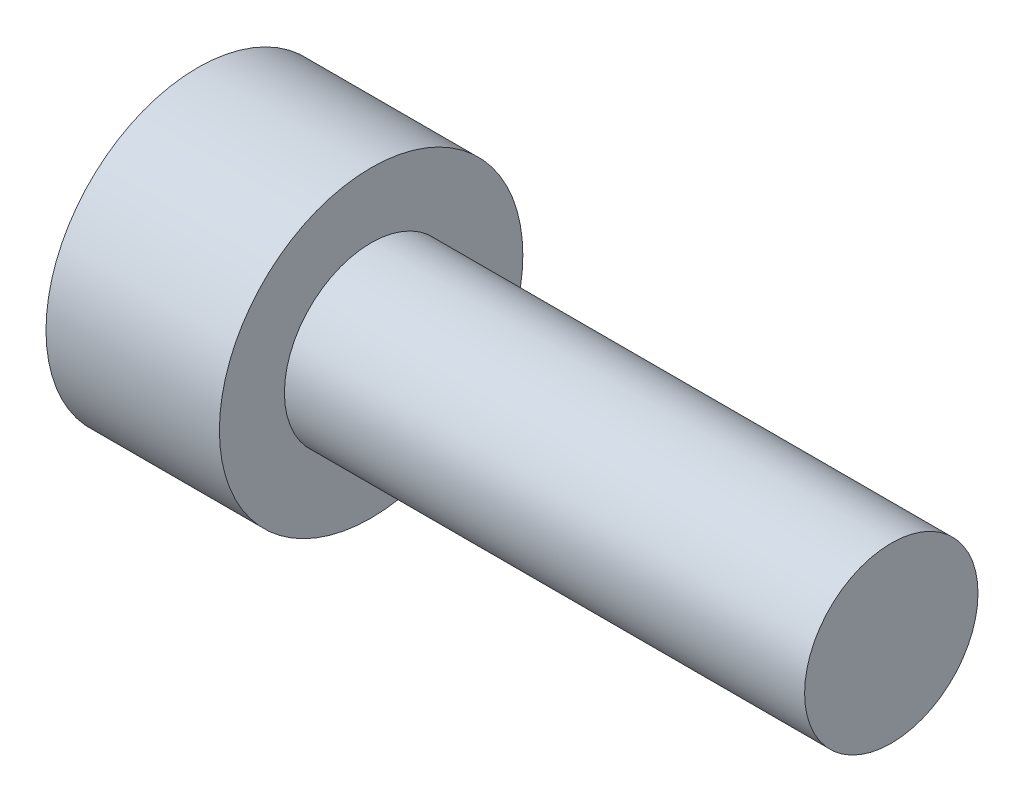
ISO-10303-21;
HEADER;
FILE_DESCRIPTION(('STEP AP214'),'2;1');
FILE_NAME('part.step','',(''),(''),'','','');
FILE_SCHEMA(('AUTOMOTIVE_DESIGN { 1 0 10303 214 1 1 1 1 }'));
ENDSEC;
DATA;
#1=APPLICATION_CONTEXT('core data for automotive mechanical design processes');
#2=APPLICATION_PROTOCOL_DEFINITION('international standard','automotive_design',2000,#1);
#3=PRODUCT_CONTEXT('',#1,'mechanical');
#4=PRODUCT('Part','Part','',(#3));
#5=PRODUCT_RELATED_PRODUCT_CATEGORY('part','',(#4));
#6=PRODUCT_DEFINITION_FORMATION('','',#4);
#7=PRODUCT_DEFINITION_CONTEXT('part definition',#1,'design');
#8=PRODUCT_DEFINITION('design','',#6,#7);
#9=PRODUCT_DEFINITION_SHAPE('','',#8);
#10=(LENGTH_UNIT() NAMED_UNIT(*) SI_UNIT(.MILLI.,.METRE.));
#11=(NAMED_UNIT(*) PLANE_ANGLE_UNIT() SI_UNIT($,.RADIAN.));
#12=(NAMED_UNIT(*) SI_UNIT($,.STERADIAN.) SOLID_ANGLE_UNIT());
#13=UNCERTAINTY_MEASURE_WITH_UNIT(LENGTH_MEASURE(1.E-05),#10,'distance_accuracy_value','');
#14=(GEOMETRIC_REPRESENTATION_CONTEXT(3) GLOBAL_UNCERTAINTY_ASSIGNED_CONTEXT((#13)) GLOBAL_UNIT_ASSIGNED_CONTEXT((#10,
#11,#12)) REPRESENTATION_CONTEXT('',''));
#15=CARTESIAN_POINT('',(0.,0.,0.));
#16=DIRECTION('',(0.,0.,1.));
#17=DIRECTION('',(1.,0.,0.));
#18=AXIS2_PLACEMENT_3D('',#15,#16,#17);
#19=CARTESIAN_POINT('',(4.,0.,0.));
#20=DIRECTION('',(-1.,0.,0.));
#21=DIRECTION('',(0.,0.,1.));
#22=AXIS2_PLACEMENT_3D('',#19,#20,#21);
#23=CYLINDRICAL_SURFACE('',#22,3.5);
#24=CARTESIAN_POINT('',(4.,0.,0.));
#25=DIRECTION('',(1.,0.,0.));
#26=DIRECTION('',(0.,0.,-1.));
#27=AXIS2_PLACEMENT_3D('',#24,#25,#26);
#28=CIRCLE('',#27,3.5);
#29=CARTESIAN_POINT('',(4.,0.,-3.5));
#30=VERTEX_POINT('',#29);
#31=EDGE_CURVE('E46',#30,#30,#28,.T.);
#32=ORIENTED_EDGE('',*,*,#31,.F.);
#33=EDGE_LOOP('',(#32));
#34=FACE_BOUND('',#33,.T.);
#35=CARTESIAN_POINT('',(0.,0.,0.));
#36=DIRECTION('',(1.,0.,0.));
#37=DIRECTION('',(0.,0.,-1.));
#38=AXIS2_PLACEMENT_3D('',#35,#36,#37);
#39=CIRCLE('',#38,3.5);
#40=CARTESIAN_POINT('',(0.,0.,-3.5));
#41=VERTEX_POINT('',#40);
#42=EDGE_CURVE('E41',#41,#41,#39,.T.);
#43=ORIENTED_EDGE('',*,*,#42,.T.);
#44=EDGE_LOOP('',(#43));
#45=FACE_BOUND('',#44,.T.);
#46=ADVANCED_FACE('F38',(#34,#45),#23,.T.);
#47=CARTESIAN_POINT('',(4.,0.,0.));
#48=DIRECTION('',(1.,0.,0.));
#49=DIRECTION('',(0.,0.,-1.));
#50=AXIS2_PLACEMENT_3D('',#47,#48,#49);
#51=PLANE('',#50);
#52=CARTESIAN_POINT('',(4.,0.,0.));
#53=DIRECTION('',(1.,0.,0.));
#54=DIRECTION('',(0.,0.,-1.));
#55=AXIS2_PLACEMENT_3D('',#52,#53,#54);
#56=CIRCLE('',#55,2.);
#57=CARTESIAN_POINT('',(4.,0.,-2.));
#58=VERTEX_POINT('',#57);
#59=EDGE_CURVE('E11',#58,#58,#56,.T.);
#60=ORIENTED_EDGE('',*,*,#59,.F.);
#61=EDGE_LOOP('',(#60));
#62=FACE_BOUND('',#61,.T.);
#63=ORIENTED_EDGE('',*,*,#31,.T.);
#64=EDGE_LOOP('',(#63));
#65=FACE_BOUND('',#64,.T.);
#66=ADVANCED_FACE('F156',(#62,#65),#51,.T.);
#67=CARTESIAN_POINT('',(0.,0.,0.));
#68=DIRECTION('',(1.,0.,0.));
#69=DIRECTION('',(0.,0.,-1.));
#70=AXIS2_PLACEMENT_3D('',#67,#68,#69);
#71=PLANE('',#70);
#72=DIRECTION('',(0.,1.,0.));
#73=VECTOR('',#72,1.);
#74=CARTESIAN_POINT('',(0.,-0.880459160514179,1.525));
#75=LINE('',#74,#73);
#76=CARTESIAN_POINT('',(0.,-0.880459160514179,1.525));
#77=VERTEX_POINT('',#76);
#78=CARTESIAN_POINT('',(0.,0.88045916051418,1.525));
#79=VERTEX_POINT('',#78);
#80=EDGE_CURVE('E128',#77,#79,#75,.T.);
#81=ORIENTED_EDGE('',*,*,#80,.F.);
#82=DIRECTION('',(0.,0.5,0.866025403784438));
#83=VECTOR('',#82,1.);
#84=CARTESIAN_POINT('',(0.,-1.76091832102836,0.));
#85=LINE('',#84,#83);
#86=CARTESIAN_POINT('',(0.,-1.76091832102836,0.));
#87=VERTEX_POINT('',#86);
#88=EDGE_CURVE('E54',#87,#77,#85,.T.);
#89=ORIENTED_EDGE('',*,*,#88,.F.);
#90=DIRECTION('',(0.,-0.5,0.866025403784439));
#91=VECTOR('',#90,1.);
#92=CARTESIAN_POINT('',(0.,-0.88045916051418,-1.525));
#93=LINE('',#92,#91);
#94=CARTESIAN_POINT('',(0.,-0.88045916051418,-1.525));
#95=VERTEX_POINT('',#94);
#96=EDGE_CURVE('E138',#95,#87,#93,.T.);
#97=ORIENTED_EDGE('',*,*,#96,.F.);
#98=DIRECTION('',(0.,-1.,0.));
#99=VECTOR('',#98,1.);
#100=CARTESIAN_POINT('',(0.,0.880459160514179,-1.525));
#101=LINE('',#100,#99);
#102=CARTESIAN_POINT('',(0.,0.880459160514179,-1.525));
#103=VERTEX_POINT('',#102);
#104=EDGE_CURVE('E136',#103,#95,#101,.T.);
#105=ORIENTED_EDGE('',*,*,#104,.F.);
#106=DIRECTION('',(0.,-0.5,-0.866025403784439));
#107=VECTOR('',#106,1.);
#108=CARTESIAN_POINT('',(0.,1.76091832102836,0.));
#109=LINE('',#108,#107);
#110=CARTESIAN_POINT('',(0.,1.76091832102836,0.));
#111=VERTEX_POINT('',#110);
#112=EDGE_CURVE('E102',#111,#103,#109,.T.);
#113=ORIENTED_EDGE('',*,*,#112,.F.);
#114=DIRECTION('',(0.,0.5,-0.866025403784439));
#115=VECTOR('',#114,1.);
#116=CARTESIAN_POINT('',(0.,0.88045916051418,1.525));
#117=LINE('',#116,#115);
#118=EDGE_CURVE('E132',#79,#111,#117,.T.);
#119=ORIENTED_EDGE('',*,*,#118,.F.);
#120=EDGE_LOOP('',(#81,#89,#97,#105,#113,#119));
#121=FACE_BOUND('',#120,.T.);
#122=ORIENTED_EDGE('',*,*,#42,.F.);
#123=EDGE_LOOP('',(#122));
#124=FACE_BOUND('',#123,.T.);
#125=ADVANCED_FACE('F153',(#121,#124),#71,.F.);
#126=CARTESIAN_POINT('',(2.,-1.76091832102836,0.));
#127=DIRECTION('',(0.,-0.866025403784439,0.5));
#128=DIRECTION('',(0.,-0.5,-0.866025403784438));
#129=AXIS2_PLACEMENT_3D('',#126,#127,#128);
#130=PLANE('',#129);
#131=ORIENTED_EDGE('',*,*,#88,.T.);
#132=DIRECTION('',(-1.,0.,0.));
#133=VECTOR('',#132,1.);
#134=CARTESIAN_POINT('',(2.,-0.880459160514179,1.525));
#135=LINE('',#134,#133);
#136=CARTESIAN_POINT('',(2.,-0.880459160514179,1.525));
#137=VERTEX_POINT('',#136);
#138=EDGE_CURVE('E84',#137,#77,#135,.T.);
#139=ORIENTED_EDGE('',*,*,#138,.F.);
#140=DIRECTION('',(0.,0.5,0.866025403784438));
#141=VECTOR('',#140,1.);
#142=CARTESIAN_POINT('',(2.,-1.76091832102836,0.));
#143=LINE('',#142,#141);
#144=CARTESIAN_POINT('',(2.,-1.76091832102836,0.));
#145=VERTEX_POINT('',#144);
#146=EDGE_CURVE('E140',#145,#137,#143,.T.);
#147=ORIENTED_EDGE('',*,*,#146,.F.);
#148=DIRECTION('',(-1.,0.,0.));
#149=VECTOR('',#148,1.);
#150=CARTESIAN_POINT('',(2.,-1.76091832102836,0.));
#151=LINE('',#150,#149);
#152=EDGE_CURVE('E62',#145,#87,#151,.T.);
#153=ORIENTED_EDGE('',*,*,#152,.T.);
#154=EDGE_LOOP('',(#131,#139,#147,#153));
#155=FACE_BOUND('',#154,.T.);
#156=ADVANCED_FACE('F155',(#155),#130,.F.);
#157=CARTESIAN_POINT('',(2.,-0.88045916051418,-1.525));
#158=DIRECTION('',(0.,-0.866025403784439,-0.5));
#159=DIRECTION('',(0.,0.5,-0.866025403784439));
#160=AXIS2_PLACEMENT_3D('',#157,#158,#159);
#161=PLANE('',#160);
#162=ORIENTED_EDGE('',*,*,#96,.T.);
#163=ORIENTED_EDGE('',*,*,#152,.F.);
#164=DIRECTION('',(0.,-0.5,0.866025403784439));
#165=VECTOR('',#164,1.);
#166=CARTESIAN_POINT('',(2.,-0.88045916051418,-1.525));
#167=LINE('',#166,#165);
#168=CARTESIAN_POINT('',(2.,-0.88045916051418,-1.525));
#169=VERTEX_POINT('',#168);
#170=EDGE_CURVE('E114',#169,#145,#167,.T.);
#171=ORIENTED_EDGE('',*,*,#170,.F.);
#172=DIRECTION('',(-1.,0.,0.));
#173=VECTOR('',#172,1.);
#174=CARTESIAN_POINT('',(2.,-0.88045916051418,-1.525));
#175=LINE('',#174,#173);
#176=EDGE_CURVE('E106',#169,#95,#175,.T.);
#177=ORIENTED_EDGE('',*,*,#176,.T.);
#178=EDGE_LOOP('',(#162,#163,#171,#177));
#179=FACE_BOUND('',#178,.T.);
#180=ADVANCED_FACE('F162',(#179),#161,.F.);
#181=CARTESIAN_POINT('',(2.,0.880459160514179,-1.525));
#182=DIRECTION('',(0.,0.,-1.));
#183=DIRECTION('',(0.,1.,0.));
#184=AXIS2_PLACEMENT_3D('',#181,#182,#183);
#185=PLANE('',#184);
#186=ORIENTED_EDGE('',*,*,#104,.T.);
#187=ORIENTED_EDGE('',*,*,#176,.F.);
#188=DIRECTION('',(0.,-1.,0.));
#189=VECTOR('',#188,1.);
#190=CARTESIAN_POINT('',(2.,0.880459160514179,-1.525));
#191=LINE('',#190,#189);
#192=CARTESIAN_POINT('',(2.,0.880459160514179,-1.525));
#193=VERTEX_POINT('',#192);
#194=EDGE_CURVE('E110',#193,#169,#191,.T.);
#195=ORIENTED_EDGE('',*,*,#194,.F.);
#196=DIRECTION('',(-1.,0.,0.));
#197=VECTOR('',#196,1.);
#198=CARTESIAN_POINT('',(2.,0.880459160514179,-1.525));
#199=LINE('',#198,#197);
#200=EDGE_CURVE('E95',#193,#103,#199,.T.);
#201=ORIENTED_EDGE('',*,*,#200,.T.);
#202=EDGE_LOOP('',(#186,#187,#195,#201));
#203=FACE_BOUND('',#202,.T.);
#204=ADVANCED_FACE('F111',(#203),#185,.F.);
#205=CARTESIAN_POINT('',(2.,1.76091832102836,0.));
#206=DIRECTION('',(0.,0.866025403784439,-0.5));
#207=DIRECTION('',(0.,0.5,0.866025403784439));
#208=AXIS2_PLACEMENT_3D('',#205,#206,#207);
#209=PLANE('',#208);
#210=ORIENTED_EDGE('',*,*,#112,.T.);
#211=ORIENTED_EDGE('',*,*,#200,.F.);
#212=DIRECTION('',(0.,-0.5,-0.866025403784439));
#213=VECTOR('',#212,1.);
#214=CARTESIAN_POINT('',(2.,1.76091832102836,0.));
#215=LINE('',#214,#213);
#216=CARTESIAN_POINT('',(2.,1.76091832102836,0.));
#217=VERTEX_POINT('',#216);
#218=EDGE_CURVE('E99',#217,#193,#215,.T.);
#219=ORIENTED_EDGE('',*,*,#218,.F.);
#220=DIRECTION('',(-1.,0.,0.));
#221=VECTOR('',#220,1.);
#222=CARTESIAN_POINT('',(2.,1.76091832102836,0.));
#223=LINE('',#222,#221);
#224=EDGE_CURVE('E107',#217,#111,#223,.T.);
#225=ORIENTED_EDGE('',*,*,#224,.T.);
#226=EDGE_LOOP('',(#210,#211,#219,#225));
#227=FACE_BOUND('',#226,.T.);
#228=ADVANCED_FACE('F97',(#227),#209,.F.);
#229=CARTESIAN_POINT('',(2.,0.88045916051418,1.525));
#230=DIRECTION('',(0.,0.866025403784439,0.5));
#231=DIRECTION('',(0.,-0.5,0.866025403784439));
#232=AXIS2_PLACEMENT_3D('',#229,#230,#231);
#233=PLANE('',#232);
#234=ORIENTED_EDGE('',*,*,#118,.T.);
#235=ORIENTED_EDGE('',*,*,#224,.F.);
#236=DIRECTION('',(0.,0.5,-0.866025403784439));
#237=VECTOR('',#236,1.);
#238=CARTESIAN_POINT('',(2.,0.88045916051418,1.525));
#239=LINE('',#238,#237);
#240=CARTESIAN_POINT('',(2.,0.88045916051418,1.525));
#241=VERTEX_POINT('',#240);
#242=EDGE_CURVE('E120',#241,#217,#239,.T.);
#243=ORIENTED_EDGE('',*,*,#242,.F.);
#244=DIRECTION('',(-1.,0.,0.));
#245=VECTOR('',#244,1.);
#246=CARTESIAN_POINT('',(2.,0.88045916051418,1.525));
#247=LINE('',#246,#245);
#248=EDGE_CURVE('E144',#241,#79,#247,.T.);
#249=ORIENTED_EDGE('',*,*,#248,.T.);
#250=EDGE_LOOP('',(#234,#235,#243,#249));
#251=FACE_BOUND('',#250,.T.);
#252=ADVANCED_FACE('F217',(#251),#233,.F.);
#253=CARTESIAN_POINT('',(2.,-0.880459160514179,1.525));
#254=DIRECTION('',(0.,0.,1.));
#255=DIRECTION('',(0.,-1.,0.));
#256=AXIS2_PLACEMENT_3D('',#253,#254,#255);
#257=PLANE('',#256);
#258=ORIENTED_EDGE('',*,*,#80,.T.);
#259=ORIENTED_EDGE('',*,*,#248,.F.);
#260=DIRECTION('',(0.,1.,0.));
#261=VECTOR('',#260,1.);
#262=CARTESIAN_POINT('',(2.,-0.880459160514179,1.525));
#263=LINE('',#262,#261);
#264=EDGE_CURVE('E122',#137,#241,#263,.T.);
#265=ORIENTED_EDGE('',*,*,#264,.F.);
#266=ORIENTED_EDGE('',*,*,#138,.T.);
#267=EDGE_LOOP('',(#258,#259,#265,#266));
#268=FACE_BOUND('',#267,.T.);
#269=ADVANCED_FACE('F213',(#268),#257,.F.);
#270=CARTESIAN_POINT('',(2.,0.,0.));
#271=DIRECTION('',(-1.,0.,0.));
#272=DIRECTION('',(0.,0.,1.));
#273=AXIS2_PLACEMENT_3D('',#270,#271,#272);
#274=PLANE('',#273);
#275=ORIENTED_EDGE('',*,*,#146,.T.);
#276=ORIENTED_EDGE('',*,*,#264,.T.);
#277=ORIENTED_EDGE('',*,*,#242,.T.);
#278=ORIENTED_EDGE('',*,*,#218,.T.);
#279=ORIENTED_EDGE('',*,*,#194,.T.);
#280=ORIENTED_EDGE('',*,*,#170,.T.);
#281=EDGE_LOOP('',(#275,#276,#277,#278,#279,#280));
#282=FACE_BOUND('',#281,.T.);
#283=ADVANCED_FACE('F117',(#282),#274,.T.);
#284=CARTESIAN_POINT('',(16.,0.,0.));
#285=DIRECTION('',(-1.,0.,0.));
#286=DIRECTION('',(0.,0.,1.));
#287=AXIS2_PLACEMENT_3D('',#284,#285,#286);
#288=CYLINDRICAL_SURFACE('',#287,2.);
#289=CARTESIAN_POINT('',(16.,0.,0.));
#290=DIRECTION('',(1.,0.,0.));
#291=DIRECTION('',(0.,0.,-1.));
#292=AXIS2_PLACEMENT_3D('',#289,#290,#291);
#293=CIRCLE('',#292,2.);
#294=CARTESIAN_POINT('',(16.,0.,-2.));
#295=VERTEX_POINT('',#294);
#296=EDGE_CURVE('E129',#295,#295,#293,.T.);
#297=ORIENTED_EDGE('',*,*,#296,.F.);
#298=EDGE_LOOP('',(#297));
#299=FACE_BOUND('',#298,.T.);
#300=ORIENTED_EDGE('',*,*,#59,.T.);
#301=EDGE_LOOP('',(#300));
#302=FACE_BOUND('',#301,.T.);
#303=ADVANCED_FACE('F186',(#299,#302),#288,.T.);
#304=CARTESIAN_POINT('',(16.,0.,0.));
#305=DIRECTION('',(1.,0.,0.));
#306=DIRECTION('',(0.,0.,-1.));
#307=AXIS2_PLACEMENT_3D('',#304,#305,#306);
#308=PLANE('',#307);
#309=ORIENTED_EDGE('',*,*,#296,.T.);
#310=EDGE_LOOP('',(#309));
#311=FACE_BOUND('',#310,.T.);
#312=ADVANCED_FACE('F192',(#311),#308,.T.);
#313=CLOSED_SHELL('',(#46,#66,#125,#156,#180,#204,#228,#252,#269,#283,#303,#312));
#314=MANIFOLD_SOLID_BREP('B2',#313);
#315=ADVANCED_BREP_SHAPE_REPRESENTATION('',(#18,#314),#14);
#316=SHAPE_DEFINITION_REPRESENTATION(#9,#315);
ENDSEC;
END-ISO-10303-21;
